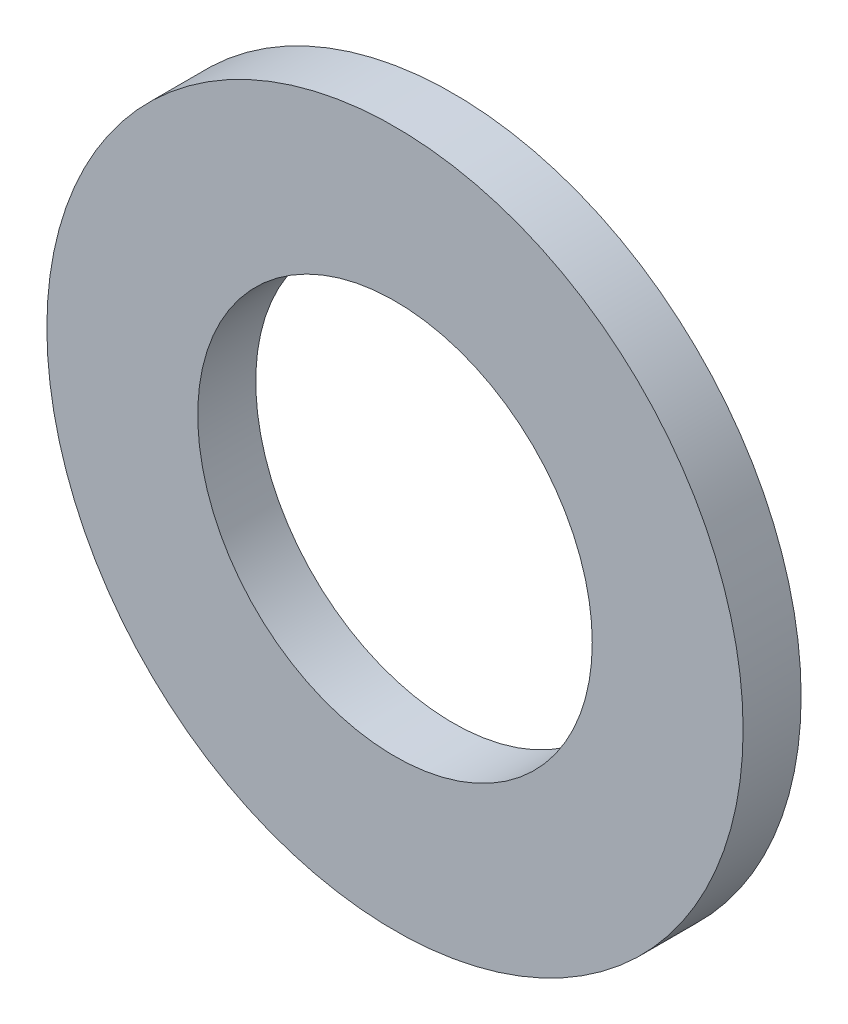
ISO-10303-21;
HEADER;
FILE_DESCRIPTION(('STEP AP214'),'2;1');
FILE_NAME('part.step','',(''),(''),'','','');
FILE_SCHEMA(('AUTOMOTIVE_DESIGN { 1 0 10303 214 1 1 1 1 }'));
ENDSEC;
DATA;
#1=APPLICATION_CONTEXT('core data for automotive mechanical design processes');
#2=APPLICATION_PROTOCOL_DEFINITION('international standard','automotive_design',2000,#1);
#3=PRODUCT_CONTEXT('',#1,'mechanical');
#4=PRODUCT('Part','Part','',(#3));
#5=PRODUCT_RELATED_PRODUCT_CATEGORY('part','',(#4));
#6=PRODUCT_DEFINITION_FORMATION('','',#4);
#7=PRODUCT_DEFINITION_CONTEXT('part definition',#1,'design');
#8=PRODUCT_DEFINITION('design','',#6,#7);
#9=PRODUCT_DEFINITION_SHAPE('','',#8);
#10=(LENGTH_UNIT() NAMED_UNIT(*) SI_UNIT(.MILLI.,.METRE.));
#11=(NAMED_UNIT(*) PLANE_ANGLE_UNIT() SI_UNIT($,.RADIAN.));
#12=(NAMED_UNIT(*) SI_UNIT($,.STERADIAN.) SOLID_ANGLE_UNIT());
#13=UNCERTAINTY_MEASURE_WITH_UNIT(LENGTH_MEASURE(1.E-05),#10,'distance_accuracy_value','');
#14=(GEOMETRIC_REPRESENTATION_CONTEXT(3) GLOBAL_UNCERTAINTY_ASSIGNED_CONTEXT((#13)) GLOBAL_UNIT_ASSIGNED_CONTEXT((#10,
#11,#12)) REPRESENTATION_CONTEXT('',''));
#15=CARTESIAN_POINT('',(0.,0.,0.));
#16=DIRECTION('',(0.,0.,1.));
#17=DIRECTION('',(1.,0.,0.));
#18=AXIS2_PLACEMENT_3D('',#15,#16,#17);
#19=CARTESIAN_POINT('',(140.,92.65,-98.16));
#20=DIRECTION('',(0.,0.,1.));
#21=DIRECTION('',(1.,0.,0.));
#22=AXIS2_PLACEMENT_3D('',#19,#20,#21);
#23=CYLINDRICAL_SURFACE('',#22,1.7);
#24=CARTESIAN_POINT('',(140.,92.65,-97.65));
#25=DIRECTION('',(0.,0.,1.));
#26=DIRECTION('',(1.,0.,0.));
#27=AXIS2_PLACEMENT_3D('',#24,#25,#26);
#28=CIRCLE('',#27,1.7);
#29=CARTESIAN_POINT('',(141.7,92.65,-97.65));
#30=VERTEX_POINT('',#29);
#31=EDGE_CURVE('E17',#30,#30,#28,.T.);
#32=ORIENTED_EDGE('',*,*,#31,.T.);
#33=EDGE_LOOP('',(#32));
#34=FACE_BOUND('',#33,.T.);
#35=CARTESIAN_POINT('',(140.,92.65,-98.15));
#36=DIRECTION('',(0.,0.,1.));
#37=DIRECTION('',(1.,0.,0.));
#38=AXIS2_PLACEMENT_3D('',#35,#36,#37);
#39=CIRCLE('',#38,1.7);
#40=CARTESIAN_POINT('',(141.7,92.65,-98.15));
#41=VERTEX_POINT('',#40);
#42=EDGE_CURVE('E9',#41,#41,#39,.T.);
#43=ORIENTED_EDGE('',*,*,#42,.F.);
#44=EDGE_LOOP('',(#43));
#45=FACE_BOUND('',#44,.T.);
#46=ADVANCED_FACE('F14',(#34,#45),#23,.F.);
#47=CARTESIAN_POINT('',(140.,92.65,-98.15));
#48=DIRECTION('',(0.,0.,1.));
#49=DIRECTION('',(1.,0.,0.));
#50=AXIS2_PLACEMENT_3D('',#47,#48,#49);
#51=PLANE('',#50);
#52=ORIENTED_EDGE('',*,*,#42,.T.);
#53=EDGE_LOOP('',(#52));
#54=FACE_BOUND('',#53,.T.);
#55=CARTESIAN_POINT('',(140.,92.65,-98.15));
#56=DIRECTION('',(0.,0.,1.));
#57=DIRECTION('',(1.,0.,0.));
#58=AXIS2_PLACEMENT_3D('',#55,#56,#57);
#59=CIRCLE('',#58,3.);
#60=CARTESIAN_POINT('',(143.,92.65,-98.15));
#61=VERTEX_POINT('',#60);
#62=EDGE_CURVE('E29',#61,#61,#59,.T.);
#63=ORIENTED_EDGE('',*,*,#62,.F.);
#64=EDGE_LOOP('',(#63));
#65=FACE_BOUND('',#64,.T.);
#66=ADVANCED_FACE('F47',(#54,#65),#51,.F.);
#67=CARTESIAN_POINT('',(140.,92.65,-97.65));
#68=DIRECTION('',(0.,0.,1.));
#69=DIRECTION('',(1.,0.,0.));
#70=AXIS2_PLACEMENT_3D('',#67,#68,#69);
#71=PLANE('',#70);
#72=ORIENTED_EDGE('',*,*,#31,.F.);
#73=EDGE_LOOP('',(#72));
#74=FACE_BOUND('',#73,.T.);
#75=CARTESIAN_POINT('',(140.,92.65,-97.65));
#76=DIRECTION('',(0.,0.,1.));
#77=DIRECTION('',(1.,0.,0.));
#78=AXIS2_PLACEMENT_3D('',#75,#76,#77);
#79=CIRCLE('',#78,3.);
#80=CARTESIAN_POINT('',(143.,92.65,-97.65));
#81=VERTEX_POINT('',#80);
#82=EDGE_CURVE('E33',#81,#81,#79,.T.);
#83=ORIENTED_EDGE('',*,*,#82,.T.);
#84=EDGE_LOOP('',(#83));
#85=FACE_BOUND('',#84,.T.);
#86=ADVANCED_FACE('F39',(#74,#85),#71,.T.);
#87=CARTESIAN_POINT('',(140.,92.65,-98.15));
#88=DIRECTION('',(0.,0.,1.));
#89=DIRECTION('',(1.,0.,0.));
#90=AXIS2_PLACEMENT_3D('',#87,#88,#89);
#91=CYLINDRICAL_SURFACE('',#90,3.);
#92=ORIENTED_EDGE('',*,*,#82,.F.);
#93=EDGE_LOOP('',(#92));
#94=FACE_BOUND('',#93,.T.);
#95=ORIENTED_EDGE('',*,*,#62,.T.);
#96=EDGE_LOOP('',(#95));
#97=FACE_BOUND('',#96,.T.);
#98=ADVANCED_FACE('F41',(#94,#97),#91,.T.);
#99=CLOSED_SHELL('',(#46,#66,#86,#98));
#100=MANIFOLD_SOLID_BREP('B1',#99);
#101=ADVANCED_BREP_SHAPE_REPRESENTATION('',(#18,#100),#14);
#102=SHAPE_DEFINITION_REPRESENTATION(#9,#101);
ENDSEC;
END-ISO-10303-21;
